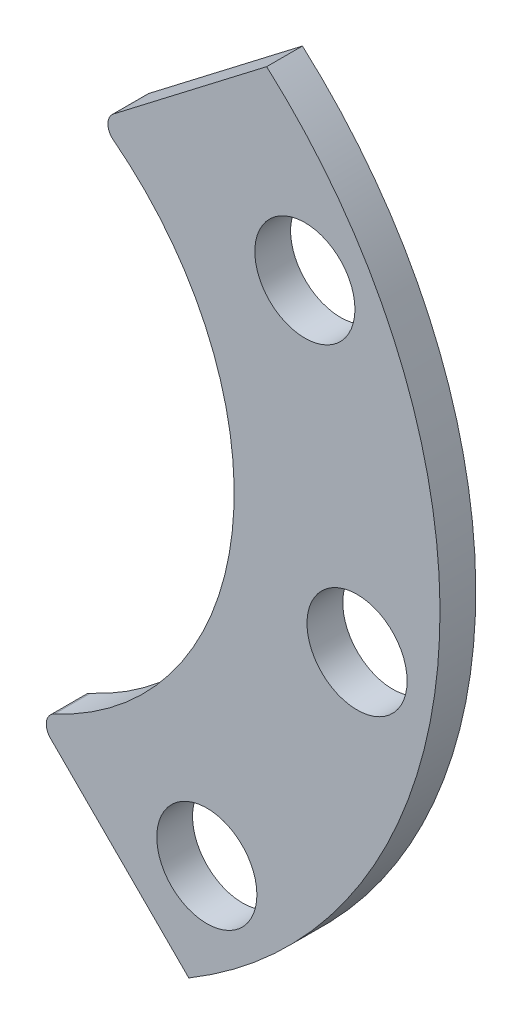
ISO-10303-21;
HEADER;
FILE_DESCRIPTION(('STEP AP214'),'2;1');
FILE_NAME('part.step','',(''),(''),'','','');
FILE_SCHEMA(('AUTOMOTIVE_DESIGN { 1 0 10303 214 1 1 1 1 }'));
ENDSEC;
DATA;
#1=APPLICATION_CONTEXT('core data for automotive mechanical design processes');
#2=APPLICATION_PROTOCOL_DEFINITION('international standard','automotive_design',2000,#1);
#3=PRODUCT_CONTEXT('',#1,'mechanical');
#4=PRODUCT('Part','Part','',(#3));
#5=PRODUCT_RELATED_PRODUCT_CATEGORY('part','',(#4));
#6=PRODUCT_DEFINITION_FORMATION('','',#4);
#7=PRODUCT_DEFINITION_CONTEXT('part definition',#1,'design');
#8=PRODUCT_DEFINITION('design','',#6,#7);
#9=PRODUCT_DEFINITION_SHAPE('','',#8);
#10=(LENGTH_UNIT() NAMED_UNIT(*) SI_UNIT(.MILLI.,.METRE.));
#11=(NAMED_UNIT(*) PLANE_ANGLE_UNIT() SI_UNIT($,.RADIAN.));
#12=(NAMED_UNIT(*) SI_UNIT($,.STERADIAN.) SOLID_ANGLE_UNIT());
#13=UNCERTAINTY_MEASURE_WITH_UNIT(LENGTH_MEASURE(1.E-05),#10,'distance_accuracy_value','');
#14=(GEOMETRIC_REPRESENTATION_CONTEXT(3) GLOBAL_UNCERTAINTY_ASSIGNED_CONTEXT((#13)) GLOBAL_UNIT_ASSIGNED_CONTEXT((#10,
#11,#12)) REPRESENTATION_CONTEXT('',''));
#15=CARTESIAN_POINT('',(0.,0.,0.));
#16=DIRECTION('',(0.,0.,1.));
#17=DIRECTION('',(1.,0.,0.));
#18=AXIS2_PLACEMENT_3D('',#15,#16,#17);
#19=CARTESIAN_POINT('',(-5.27308176852065,6.87018269030018,3.175));
#20=DIRECTION('',(-0.608863546148152,0.793274972611576,0.));
#21=DIRECTION('',(-0.793274972611577,-0.608863546148152,0.));
#22=AXIS2_PLACEMENT_3D('',#19,#20,#21);
#23=PLANE('',#22);
#24=DIRECTION('',(0.793274972611577,0.608863546148152,0.));
#25=VECTOR('',#24,1.);
#26=CARTESIAN_POINT('',(-5.27308176852065,6.87018269030018,0.));
#27=LINE('',#26,#25);
#28=CARTESIAN_POINT('',(16.7798774081538,23.7965239855083,0.));
#29=VERTEX_POINT('',#28);
#30=CARTESIAN_POINT('',(30.3812356354192,34.2359951507471,0.));
#31=VERTEX_POINT('',#30);
#32=EDGE_CURVE('E129',#29,#31,#27,.T.);
#33=ORIENTED_EDGE('',*,*,#32,.F.);
#34=DIRECTION('',(0.,0.,-1.));
#35=VECTOR('',#34,1.);
#36=CARTESIAN_POINT('',(16.7798774081538,23.7965239855083,3.175));
#37=LINE('',#36,#35);
#38=CARTESIAN_POINT('',(16.7798774081538,23.7965239855083,3.175));
#39=VERTEX_POINT('',#38);
#40=EDGE_CURVE('E11',#39,#29,#37,.T.);
#41=ORIENTED_EDGE('',*,*,#40,.F.);
#42=DIRECTION('',(0.793274972611577,0.608863546148152,0.));
#43=VECTOR('',#42,1.);
#44=CARTESIAN_POINT('',(-5.27308176852065,6.87018269030018,3.175));
#45=LINE('',#44,#43);
#46=CARTESIAN_POINT('',(30.3812356354192,34.2359951507471,3.175));
#47=VERTEX_POINT('',#46);
#48=EDGE_CURVE('E256',#39,#47,#45,.T.);
#49=ORIENTED_EDGE('',*,*,#48,.T.);
#50=DIRECTION('',(0.,0.,-1.));
#51=VECTOR('',#50,1.);
#52=CARTESIAN_POINT('',(30.3812356354192,34.2359951507471,3.175));
#53=LINE('',#52,#51);
#54=EDGE_CURVE('E54',#47,#31,#53,.T.);
#55=ORIENTED_EDGE('',*,*,#54,.T.);
#56=EDGE_LOOP('',(#33,#41,#49,#55));
#57=FACE_BOUND('',#56,.T.);
#58=ADVANCED_FACE('F37',(#57),#23,.T.);
#59=CARTESIAN_POINT('',(17.5531341117619,22.7890647702916,3.175));
#60=DIRECTION('',(0.,0.,-1.));
#61=DIRECTION('',(-1.,0.,0.));
#62=AXIS2_PLACEMENT_3D('',#59,#60,#61);
#63=CYLINDRICAL_SURFACE('',#62,1.27000000000001);
#64=CARTESIAN_POINT('',(17.5531341117619,22.7890647702916,0.));
#65=DIRECTION('',(0.,0.,1.));
#66=DIRECTION('',(1.,0.,0.));
#67=AXIS2_PLACEMENT_3D('',#64,#65,#66);
#68=CIRCLE('',#67,1.27000000000001);
#69=CARTESIAN_POINT('',(16.7781613032957,21.7829250453339,0.));
#70=VERTEX_POINT('',#69);
#71=EDGE_CURVE('E131',#29,#70,#68,.T.);
#72=ORIENTED_EDGE('',*,*,#71,.T.);
#73=DIRECTION('',(0.,0.,-1.));
#74=VECTOR('',#73,1.);
#75=CARTESIAN_POINT('',(16.7781613032957,21.7829250453339,3.175));
#76=LINE('',#75,#74);
#77=CARTESIAN_POINT('',(16.7781613032957,21.7829250453339,3.175));
#78=VERTEX_POINT('',#77);
#79=EDGE_CURVE('E46',#78,#70,#76,.T.);
#80=ORIENTED_EDGE('',*,*,#79,.F.);
#81=CARTESIAN_POINT('',(17.5531341117619,22.7890647702916,3.175));
#82=DIRECTION('',(0.,0.,1.));
#83=DIRECTION('',(1.,0.,0.));
#84=AXIS2_PLACEMENT_3D('',#81,#82,#83);
#85=CIRCLE('',#84,1.27000000000001);
#86=EDGE_CURVE('E258',#39,#78,#85,.T.);
#87=ORIENTED_EDGE('',*,*,#86,.F.);
#88=ORIENTED_EDGE('',*,*,#40,.T.);
#89=EDGE_LOOP('',(#72,#80,#87,#88));
#90=FACE_BOUND('',#89,.T.);
#91=ADVANCED_FACE('F158',(#90),#63,.T.);
#92=CARTESIAN_POINT('',(0.,0.,3.175));
#93=DIRECTION('',(0.,0.,-1.));
#94=DIRECTION('',(-1.,0.,0.));
#95=AXIS2_PLACEMENT_3D('',#92,#93,#94);
#96=CYLINDRICAL_SURFACE('',#95,27.4955000000008);
#97=CARTESIAN_POINT('',(0.,0.,0.));
#98=DIRECTION('',(0.,0.,1.));
#99=DIRECTION('',(1.,0.,0.));
#100=AXIS2_PLACEMENT_3D('',#97,#98,#99);
#101=CIRCLE('',#100,27.4955000000008);
#102=CARTESIAN_POINT('',(11.5458669582281,-24.9538669635177,0.));
#103=VERTEX_POINT('',#102);
#104=EDGE_CURVE('E134',#103,#70,#101,.T.);
#105=ORIENTED_EDGE('',*,*,#104,.F.);
#106=DIRECTION('',(0.,0.,-1.));
#107=VECTOR('',#106,1.);
#108=CARTESIAN_POINT('',(11.5458669582281,-24.9538669635177,3.175));
#109=LINE('',#108,#107);
#110=CARTESIAN_POINT('',(11.5458669582281,-24.9538669635177,3.175));
#111=VERTEX_POINT('',#110);
#112=EDGE_CURVE('E112',#111,#103,#109,.T.);
#113=ORIENTED_EDGE('',*,*,#112,.F.);
#114=CARTESIAN_POINT('',(0.,0.,3.175));
#115=DIRECTION('',(0.,0.,1.));
#116=DIRECTION('',(1.,0.,0.));
#117=AXIS2_PLACEMENT_3D('',#114,#115,#116);
#118=CIRCLE('',#117,27.4955000000008);
#119=EDGE_CURVE('E102',#111,#78,#118,.T.);
#120=ORIENTED_EDGE('',*,*,#119,.T.);
#121=ORIENTED_EDGE('',*,*,#79,.T.);
#122=EDGE_LOOP('',(#105,#113,#120,#121));
#123=FACE_BOUND('',#122,.T.);
#124=ADVANCED_FACE('F155',(#123),#96,.F.);
#125=CARTESIAN_POINT('',(12.0791633535273,-26.1064705184146,3.175));
#126=DIRECTION('',(0.,0.,-1.));
#127=DIRECTION('',(-1.,0.,0.));
#128=AXIS2_PLACEMENT_3D('',#125,#126,#127);
#129=CYLINDRICAL_SURFACE('',#128,1.27000000000005);
#130=CARTESIAN_POINT('',(12.0791633535273,-26.1064705184146,0.));
#131=DIRECTION('',(0.,0.,1.));
#132=DIRECTION('',(1.,0.,0.));
#133=AXIS2_PLACEMENT_3D('',#130,#131,#132);
#134=CIRCLE('',#133,1.27000000000005);
#135=CARTESIAN_POINT('',(11.1810312843104,-27.00438966079,0.));
#136=VERTEX_POINT('',#135);
#137=EDGE_CURVE('E109',#103,#136,#134,.T.);
#138=ORIENTED_EDGE('',*,*,#137,.T.);
#139=DIRECTION('',(0.,0.,-1.));
#140=VECTOR('',#139,1.);
#141=CARTESIAN_POINT('',(11.1810312843104,-27.00438966079,3.175));
#142=LINE('',#141,#140);
#143=CARTESIAN_POINT('',(11.1810312843104,-27.00438966079,3.175));
#144=VERTEX_POINT('',#143);
#145=EDGE_CURVE('E106',#144,#136,#142,.T.);
#146=ORIENTED_EDGE('',*,*,#145,.F.);
#147=CARTESIAN_POINT('',(12.0791633535273,-26.1064705184146,3.175));
#148=DIRECTION('',(0.,0.,1.));
#149=DIRECTION('',(1.,0.,0.));
#150=AXIS2_PLACEMENT_3D('',#147,#148,#149);
#151=CIRCLE('',#150,1.27000000000005);
#152=EDGE_CURVE('E93',#111,#144,#151,.T.);
#153=ORIENTED_EDGE('',*,*,#152,.F.);
#154=ORIENTED_EDGE('',*,*,#112,.T.);
#155=EDGE_LOOP('',(#138,#146,#153,#154));
#156=FACE_BOUND('',#155,.T.);
#157=ADVANCED_FACE('F107',(#156),#129,.T.);
#158=CARTESIAN_POINT('',(-7.91035326651714,-7.90847790030529,3.175));
#159=DIRECTION('',(-0.707190605682607,-0.707022946752273,0.));
#160=DIRECTION('',(0.707022946752273,-0.707190605682607,0.));
#161=AXIS2_PLACEMENT_3D('',#158,#159,#160);
#162=PLANE('',#161);
#163=DIRECTION('',(-0.707022946752273,0.707190605682607,0.));
#164=VECTOR('',#163,1.);
#165=CARTESIAN_POINT('',(-7.91035326651714,-7.90847790030529,0.));
#166=LINE('',#165,#164);
#167=CARTESIAN_POINT('',(23.4706762902271,-39.2969489550553,0.));
#168=VERTEX_POINT('',#167);
#169=EDGE_CURVE('E138',#168,#136,#166,.T.);
#170=ORIENTED_EDGE('',*,*,#169,.F.);
#171=DIRECTION('',(0.,0.,-1.));
#172=VECTOR('',#171,1.);
#173=CARTESIAN_POINT('',(23.4706762902271,-39.2969489550553,3.175));
#174=LINE('',#173,#172);
#175=CARTESIAN_POINT('',(23.4706762902271,-39.2969489550553,3.175));
#176=VERTEX_POINT('',#175);
#177=EDGE_CURVE('E73',#176,#168,#174,.T.);
#178=ORIENTED_EDGE('',*,*,#177,.F.);
#179=DIRECTION('',(-0.707022946752273,0.707190605682607,0.));
#180=VECTOR('',#179,1.);
#181=CARTESIAN_POINT('',(-7.91035326651714,-7.90847790030529,3.175));
#182=LINE('',#181,#180);
#183=EDGE_CURVE('E100',#176,#144,#182,.T.);
#184=ORIENTED_EDGE('',*,*,#183,.T.);
#185=ORIENTED_EDGE('',*,*,#145,.T.);
#186=EDGE_LOOP('',(#170,#178,#184,#185));
#187=FACE_BOUND('',#186,.T.);
#188=ADVANCED_FACE('F114',(#187),#162,.T.);
#189=CARTESIAN_POINT('',(38.4075023458103,-6.77227892518939,3.175));
#190=DIRECTION('',(0.,0.,-1.));
#191=DIRECTION('',(-1.,0.,0.));
#192=AXIS2_PLACEMENT_3D('',#189,#190,#191);
#193=CYLINDRICAL_SURFACE('',#192,4.445);
#194=CARTESIAN_POINT('',(38.4075023458103,-6.77227892518939,3.175));
#195=DIRECTION('',(0.,0.,1.));
#196=DIRECTION('',(1.,0.,0.));
#197=AXIS2_PLACEMENT_3D('',#194,#195,#196);
#198=CIRCLE('',#197,4.445);
#199=CARTESIAN_POINT('',(42.8525023458103,-6.77227892518939,3.175));
#200=VERTEX_POINT('',#199);
#201=EDGE_CURVE('E117',#200,#200,#198,.T.);
#202=ORIENTED_EDGE('',*,*,#201,.T.);
#203=EDGE_LOOP('',(#202));
#204=FACE_BOUND('',#203,.T.);
#205=CARTESIAN_POINT('',(38.4075023458103,-6.77227892518939,0.));
#206=DIRECTION('',(0.,0.,1.));
#207=DIRECTION('',(1.,0.,0.));
#208=AXIS2_PLACEMENT_3D('',#205,#206,#207);
#209=CIRCLE('',#208,4.445);
#210=CARTESIAN_POINT('',(42.8525023458103,-6.77227892518939,0.));
#211=VERTEX_POINT('',#210);
#212=EDGE_CURVE('E143',#211,#211,#209,.T.);
#213=ORIENTED_EDGE('',*,*,#212,.F.);
#214=EDGE_LOOP('',(#213));
#215=FACE_BOUND('',#214,.T.);
#216=ADVANCED_FACE('F164',(#204,#215),#193,.F.);
#217=CARTESIAN_POINT('',(0.,0.,3.175));
#218=DIRECTION('',(0.,0.,-1.));
#219=DIRECTION('',(-1.,0.,0.));
#220=AXIS2_PLACEMENT_3D('',#217,#218,#219);
#221=CYLINDRICAL_SURFACE('',#220,45.7725118678978);
#222=CARTESIAN_POINT('',(0.,0.,0.));
#223=DIRECTION('',(0.,0.,1.));
#224=DIRECTION('',(1.,0.,0.));
#225=AXIS2_PLACEMENT_3D('',#222,#223,#224);
#226=CIRCLE('',#225,45.7725118678978);
#227=EDGE_CURVE('E140',#31,#168,#226,.F.);
#228=ORIENTED_EDGE('',*,*,#227,.F.);
#229=ORIENTED_EDGE('',*,*,#54,.F.);
#230=CARTESIAN_POINT('',(0.,0.,3.175));
#231=DIRECTION('',(0.,0.,1.));
#232=DIRECTION('',(1.,0.,0.));
#233=AXIS2_PLACEMENT_3D('',#230,#231,#232);
#234=CIRCLE('',#233,45.7725118678978);
#235=EDGE_CURVE('E115',#47,#176,#234,.F.);
#236=ORIENTED_EDGE('',*,*,#235,.T.);
#237=ORIENTED_EDGE('',*,*,#177,.T.);
#238=EDGE_LOOP('',(#228,#229,#236,#237));
#239=FACE_BOUND('',#238,.T.);
#240=ADVANCED_FACE('F162',(#239),#221,.T.);
#241=CARTESIAN_POINT('',(25.0687167636342,-29.8757332647868,3.175));
#242=DIRECTION('',(0.,0.,-1.));
#243=DIRECTION('',(-1.,0.,0.));
#244=AXIS2_PLACEMENT_3D('',#241,#242,#243);
#245=CYLINDRICAL_SURFACE('',#244,4.44499999999995);
#246=CARTESIAN_POINT('',(25.0687167636342,-29.8757332647868,3.175));
#247=DIRECTION('',(0.,0.,1.));
#248=DIRECTION('',(1.,0.,0.));
#249=AXIS2_PLACEMENT_3D('',#246,#247,#248);
#250=CIRCLE('',#249,4.44499999999995);
#251=CARTESIAN_POINT('',(29.5137167636342,-29.8757332647868,3.175));
#252=VERTEX_POINT('',#251);
#253=EDGE_CURVE('E149',#252,#252,#250,.T.);
#254=ORIENTED_EDGE('',*,*,#253,.T.);
#255=EDGE_LOOP('',(#254));
#256=FACE_BOUND('',#255,.T.);
#257=CARTESIAN_POINT('',(25.0687167636342,-29.8757332647868,0.));
#258=DIRECTION('',(0.,0.,1.));
#259=DIRECTION('',(1.,0.,0.));
#260=AXIS2_PLACEMENT_3D('',#257,#258,#259);
#261=CIRCLE('',#260,4.44499999999995);
#262=CARTESIAN_POINT('',(29.5137167636342,-29.8757332647868,0.));
#263=VERTEX_POINT('',#262);
#264=EDGE_CURVE('E126',#263,#263,#261,.T.);
#265=ORIENTED_EDGE('',*,*,#264,.F.);
#266=EDGE_LOOP('',(#265));
#267=FACE_BOUND('',#266,.T.);
#268=ADVANCED_FACE('F39',(#256,#267),#245,.F.);
#269=CARTESIAN_POINT('',(33.7749907285402,19.4999999890006,3.175));
#270=DIRECTION('',(0.,0.,-1.));
#271=DIRECTION('',(-1.,0.,0.));
#272=AXIS2_PLACEMENT_3D('',#269,#270,#271);
#273=CYLINDRICAL_SURFACE('',#272,4.445);
#274=CARTESIAN_POINT('',(33.7749907285402,19.4999999890006,3.175));
#275=DIRECTION('',(0.,0.,1.));
#276=DIRECTION('',(1.,0.,0.));
#277=AXIS2_PLACEMENT_3D('',#274,#275,#276);
#278=CIRCLE('',#277,4.445);
#279=CARTESIAN_POINT('',(38.2199907285402,19.4999999890006,3.175));
#280=VERTEX_POINT('',#279);
#281=EDGE_CURVE('E123',#280,#280,#278,.T.);
#282=ORIENTED_EDGE('',*,*,#281,.T.);
#283=EDGE_LOOP('',(#282));
#284=FACE_BOUND('',#283,.T.);
#285=CARTESIAN_POINT('',(33.7749907285402,19.4999999890006,0.));
#286=DIRECTION('',(0.,0.,1.));
#287=DIRECTION('',(1.,0.,0.));
#288=AXIS2_PLACEMENT_3D('',#285,#286,#287);
#289=CIRCLE('',#288,4.445);
#290=CARTESIAN_POINT('',(38.2199907285402,19.4999999890006,0.));
#291=VERTEX_POINT('',#290);
#292=EDGE_CURVE('E146',#291,#291,#289,.T.);
#293=ORIENTED_EDGE('',*,*,#292,.F.);
#294=EDGE_LOOP('',(#293));
#295=FACE_BOUND('',#294,.T.);
#296=ADVANCED_FACE('F170',(#284,#295),#273,.F.);
#297=CARTESIAN_POINT('',(0.,0.,3.175));
#298=DIRECTION('',(0.,0.,1.));
#299=DIRECTION('',(1.,0.,0.));
#300=AXIS2_PLACEMENT_3D('',#297,#298,#299);
#301=PLANE('',#300);
#302=ORIENTED_EDGE('',*,*,#253,.F.);
#303=EDGE_LOOP('',(#302));
#304=FACE_BOUND('',#303,.T.);
#305=ORIENTED_EDGE('',*,*,#48,.F.);
#306=ORIENTED_EDGE('',*,*,#86,.T.);
#307=ORIENTED_EDGE('',*,*,#119,.F.);
#308=ORIENTED_EDGE('',*,*,#152,.T.);
#309=ORIENTED_EDGE('',*,*,#183,.F.);
#310=ORIENTED_EDGE('',*,*,#235,.F.);
#311=EDGE_LOOP('',(#305,#306,#307,#308,#309,#310));
#312=FACE_BOUND('',#311,.T.);
#313=ORIENTED_EDGE('',*,*,#201,.F.);
#314=EDGE_LOOP('',(#313));
#315=FACE_BOUND('',#314,.T.);
#316=ORIENTED_EDGE('',*,*,#281,.F.);
#317=EDGE_LOOP('',(#316));
#318=FACE_BOUND('',#317,.T.);
#319=ADVANCED_FACE('F96',(#304,#312,#315,#318),#301,.T.);
#320=CARTESIAN_POINT('',(0.,0.,0.));
#321=DIRECTION('',(0.,0.,1.));
#322=DIRECTION('',(1.,0.,0.));
#323=AXIS2_PLACEMENT_3D('',#320,#321,#322);
#324=PLANE('',#323);
#325=ORIENTED_EDGE('',*,*,#264,.T.);
#326=EDGE_LOOP('',(#325));
#327=FACE_BOUND('',#326,.T.);
#328=ORIENTED_EDGE('',*,*,#32,.T.);
#329=ORIENTED_EDGE('',*,*,#227,.T.);
#330=ORIENTED_EDGE('',*,*,#169,.T.);
#331=ORIENTED_EDGE('',*,*,#137,.F.);
#332=ORIENTED_EDGE('',*,*,#104,.T.);
#333=ORIENTED_EDGE('',*,*,#71,.F.);
#334=EDGE_LOOP('',(#328,#329,#330,#331,#332,#333));
#335=FACE_BOUND('',#334,.T.);
#336=ORIENTED_EDGE('',*,*,#212,.T.);
#337=EDGE_LOOP('',(#336));
#338=FACE_BOUND('',#337,.T.);
#339=ORIENTED_EDGE('',*,*,#292,.T.);
#340=EDGE_LOOP('',(#339));
#341=FACE_BOUND('',#340,.T.);
#342=ADVANCED_FACE('F160',(#327,#335,#338,#341),#324,.F.);
#343=CLOSED_SHELL('',(#58,#91,#124,#157,#188,#216,#240,#268,#296,#319,#342));
#344=MANIFOLD_SOLID_BREP('B2',#343);
#345=ADVANCED_BREP_SHAPE_REPRESENTATION('',(#18,#344),#14);
#346=SHAPE_DEFINITION_REPRESENTATION(#9,#345);
ENDSEC;
END-ISO-10303-21;
